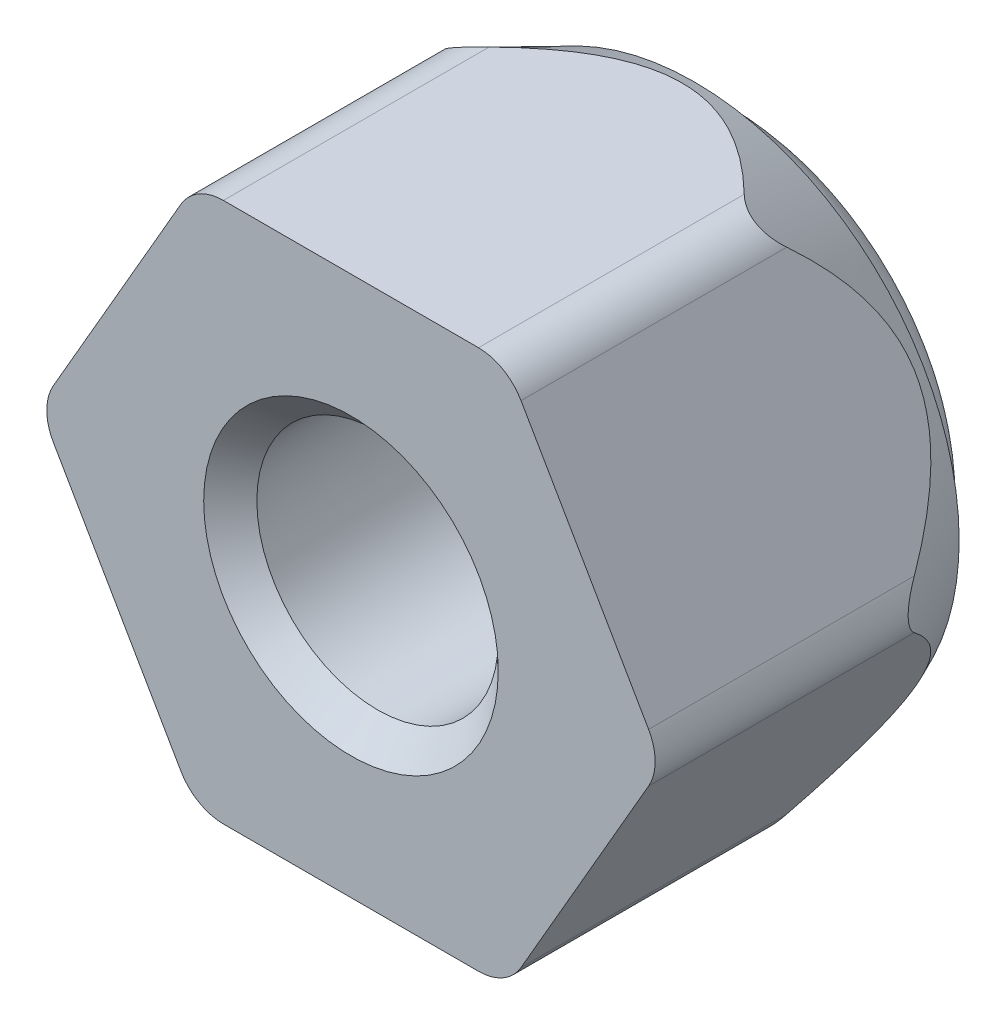
ISO-10303-21;
HEADER;
FILE_DESCRIPTION(('STEP AP214'),'2;1');
FILE_NAME('part.step','',(''),(''),'','','');
FILE_SCHEMA(('AUTOMOTIVE_DESIGN { 1 0 10303 214 1 1 1 1 }'));
ENDSEC;
DATA;
#1=APPLICATION_CONTEXT('core data for automotive mechanical design processes');
#2=APPLICATION_PROTOCOL_DEFINITION('international standard','automotive_design',2000,#1);
#3=PRODUCT_CONTEXT('',#1,'mechanical');
#4=PRODUCT('Part','Part','',(#3));
#5=PRODUCT_RELATED_PRODUCT_CATEGORY('part','',(#4));
#6=PRODUCT_DEFINITION_FORMATION('','',#4);
#7=PRODUCT_DEFINITION_CONTEXT('part definition',#1,'design');
#8=PRODUCT_DEFINITION('design','',#6,#7);
#9=PRODUCT_DEFINITION_SHAPE('','',#8);
#10=(LENGTH_UNIT() NAMED_UNIT(*) SI_UNIT(.MILLI.,.METRE.));
#11=(NAMED_UNIT(*) PLANE_ANGLE_UNIT() SI_UNIT($,.RADIAN.));
#12=(NAMED_UNIT(*) SI_UNIT($,.STERADIAN.) SOLID_ANGLE_UNIT());
#13=UNCERTAINTY_MEASURE_WITH_UNIT(LENGTH_MEASURE(1.E-05),#10,'distance_accuracy_value','');
#14=(GEOMETRIC_REPRESENTATION_CONTEXT(3) GLOBAL_UNCERTAINTY_ASSIGNED_CONTEXT((#13)) GLOBAL_UNIT_ASSIGNED_CONTEXT((#10,
#11,#12)) REPRESENTATION_CONTEXT('',''));
#15=CARTESIAN_POINT('',(0.,0.,0.));
#16=DIRECTION('',(0.,0.,1.));
#17=DIRECTION('',(1.,0.,0.));
#18=AXIS2_PLACEMENT_3D('',#15,#16,#17);
#19=CARTESIAN_POINT('',(0.,0.,-3.2));
#20=DIRECTION('',(0.,0.,1.));
#21=DIRECTION('',(1.,0.,0.));
#22=AXIS2_PLACEMENT_3D('',#19,#20,#21);
#23=CONICAL_SURFACE('',#22,2.8252125,0.412633370668645);
#24=CARTESIAN_POINT('',(-3.175425,0.,-2.4));
#25=CARTESIAN_POINT('',(-2.38156875,1.3749993589061,-4.21342756183746));
#26=CARTESIAN_POINT('',(-1.5877125,2.7499987178122,-2.4));
#27=(BOUNDED_CURVE() B_SPLINE_CURVE(2,(#24,#25,#26),.UNSPECIFIED.,.F.,
.F.) B_SPLINE_CURVE_WITH_KNOTS((3,3),(0.,3.72303709252941),
.UNSPECIFIED.) CURVE() GEOMETRIC_REPRESENTATION_ITEM() RATIONAL_B_SPLINE_CURVE((1.,
1.15470053837925,1.)) REPRESENTATION_ITEM(''));
#28=CARTESIAN_POINT('',(-3.03108743270664,0.249999999992984,-2.70620314324602));
#29=VERTEX_POINT('',#28);
#30=CARTESIAN_POINT('',(-1.73205006729336,2.49999871781922,-2.70620314324602));
#31=VERTEX_POINT('',#30);
#32=EDGE_CURVE('E167',#29,#31,#27,.T.);
#33=ORIENTED_EDGE('',*,*,#32,.T.);
#34=CARTESIAN_POINT('',(-1.73205006729741,2.4999987178122,-2.70620314325392));
#35=CARTESIAN_POINT('',(-1.72500235638727,2.51218065637914,-2.69249101317874));
#36=CARTESIAN_POINT('',(-1.71717853792669,2.52456508008095,-2.67923815831138));
#37=CARTESIAN_POINT('',(-1.69955003206397,2.54971978363477,-2.65407203787281));
#38=CARTESIAN_POINT('',(-1.68971821408732,2.56249305537071,-2.64218103480386));
#39=CARTESIAN_POINT('',(-1.66950301537542,2.58608976976235,-2.62224226638844));
#40=CARTESIAN_POINT('',(-1.6594331833388,2.59691307276756,-2.61388490022287));
#41=CARTESIAN_POINT('',(-1.63761038675392,2.6182364980293,-2.59935023034787));
#42=CARTESIAN_POINT('',(-1.62586657810883,2.62873802356967,-2.59316166265501));
#43=CARTESIAN_POINT('',(-1.6032850388694,2.64698657029615,-2.58450212274873));
#44=CARTESIAN_POINT('',(-1.59274391967273,2.65486132459152,-2.58153257362375));
#45=CARTESIAN_POINT('',(-1.5708041414586,2.6699026918324,-2.57759174847695));
#46=CARTESIAN_POINT('',(-1.55940546017375,2.6770692863787,-2.57662052436205));
#47=CARTESIAN_POINT('',(-1.53606199391658,2.69045364111738,-2.57677481640606));
#48=CARTESIAN_POINT('',(-1.52411664763664,2.69667039627269,-2.57790253708523));
#49=CARTESIAN_POINT('',(-1.50006761147746,2.70799862067953,-2.58214580661311));
#50=CARTESIAN_POINT('',(-1.48796391416191,2.71311003782435,-2.58526144914709));
#51=CARTESIAN_POINT('',(-1.46074331206648,2.7234066558375,-2.59426796580102));
#52=CARTESIAN_POINT('',(-1.44567199057678,2.72825704284705,-2.60067350963998));
#53=CARTESIAN_POINT('',(-1.41611677331774,2.73634130675424,-2.61563699284574));
#54=CARTESIAN_POINT('',(-1.40163628533218,2.73956676856398,-2.62420579884519));
#55=CARTESIAN_POINT('',(-1.37166041726426,2.74496151523924,-2.64412789120107));
#56=CARTESIAN_POINT('',(-1.35627880893126,2.74693830728615,-2.6556985455645));
#57=CARTESIAN_POINT('',(-1.3267795325607,2.74944154515591,-2.68011514586169));
#58=CARTESIAN_POINT('',(-1.31264742104093,2.74998751369189,-2.69294142123595));
#59=CARTESIAN_POINT('',(-1.29903736540519,2.7499987178122,-2.70620314325392));
#60=B_SPLINE_CURVE_WITH_KNOTS('',3,(#34,#35,#36,#37,#38,#39,#40,#41,#42,#43,#44,#45,#46,#47,#48,
#49,#50,#51,#52,#53,#54,#55,#56,#57,#58,#59),.UNSPECIFIED.,.F.,.F.,(4,2,2,2,2,2,2,2,2,2,2,2,4),
(0.,0.059057690934764,0.118973500909618,0.16973892411379,0.220236639722502,0.260527967179101,
0.300820341198279,0.341155058152381,0.381491676110493,0.432447114338653,0.483663793228779,
0.541556996478376,0.598656067901465),.UNSPECIFIED.);
#61=CARTESIAN_POINT('',(-1.29903736541329,2.7499987178122,-2.70620314324602));
#62=VERTEX_POINT('',#61);
#63=EDGE_CURVE('E262',#31,#62,#60,.T.);
#64=ORIENTED_EDGE('',*,*,#63,.T.);
#65=CARTESIAN_POINT('',(-1.5877125,2.7499987178122,-2.4));
#66=CARTESIAN_POINT('',(0.,2.7499987178122,-4.21342756183746));
#67=CARTESIAN_POINT('',(1.5877125,2.7499987178122,-2.4));
#68=(BOUNDED_CURVE() B_SPLINE_CURVE(2,(#65,#66,#67),.UNSPECIFIED.,.F.,
.F.) B_SPLINE_CURVE_WITH_KNOTS((3,3),(0.,3.72303709252942),
.UNSPECIFIED.) CURVE() GEOMETRIC_REPRESENTATION_ITEM() RATIONAL_B_SPLINE_CURVE((1.,
1.15470053837925,1.)) REPRESENTATION_ITEM(''));
#69=CARTESIAN_POINT('',(1.29903736541329,2.7499987178122,-2.70620314324602));
#70=VERTEX_POINT('',#69);
#71=EDGE_CURVE('E162',#62,#70,#68,.T.);
#72=ORIENTED_EDGE('',*,*,#71,.T.);
#73=CARTESIAN_POINT('',(1.29903736540519,2.7499987178122,-2.70620314325392));
#74=CARTESIAN_POINT('',(1.31311108912656,2.74998619040896,-2.69249101317874));
#75=CARTESIAN_POINT('',(1.32774822389385,2.7494027767184,-2.67923815831138));
#76=CARTESIAN_POINT('',(1.35834708912749,2.74671339458744,-2.65407203787281));
#77=CARTESIAN_POINT('',(1.37432497592857,2.74458542632225,-2.64218103480386));
#78=CARTESIAN_POINT('',(1.40486792939354,2.73887690789101,-2.62224226638844));
#79=CARTESIAN_POINT('',(1.41927610076722,2.73556782903806,-2.61388490022287));
#80=CARTESIAN_POINT('',(1.44865412703202,2.7273304454448,-2.59935023034788));
#81=CARTESIAN_POINT('',(1.46362061925102,2.72241077159115,-2.59316166265501));
#82=CARTESIAN_POINT('',(1.49071509391801,2.7119788583165,-2.58450212274873));
#83=CARTESIAN_POINT('',(1.5028053907847,2.70678735845554,-2.58153257362375));
#84=CARTESIAN_POINT('',(1.52680148603002,2.69530763678915,-2.57759174847695));
#85=CARTESIAN_POINT('',(1.53870727960816,2.68901938649998,-2.57662052436205));
#86=CARTESIAN_POINT('',(1.5619702039537,2.67549552907822,-2.57677481640606));
#87=CARTESIAN_POINT('',(1.57332674498728,2.66825893332045,-2.57790253708523));
#88=CARTESIAN_POINT('',(1.59516179318297,2.6530959692735,-2.58214580661311));
#89=CARTESIAN_POINT('',(1.60564025893749,2.64516956849091,-2.58526144914709));
#90=CARTESIAN_POINT('',(1.62816769275766,2.62674414457654,-2.59426796580102));
#91=CARTESIAN_POINT('',(1.63990391187096,2.61611719080263,-2.60067350963998));
#92=CARTESIAN_POINT('',(1.66168269841501,2.59456375379553,-2.61563699284574));
#93=CARTESIAN_POINT('',(1.67171627427397,2.58363601424571,-2.62420579884518));
#94=CARTESIAN_POINT('',(1.69137619597568,2.56037352433603,-2.64412789120107));
#95=CARTESIAN_POINT('',(1.7007789522728,2.54804105679204,-2.6556985455645));
#96=CARTESIAN_POINT('',(1.71769645804501,2.52374555299677,-2.68011514586169));
#97=CARTESIAN_POINT('',(1.72523533642672,2.51177976967952,-2.69294142123595));
#98=CARTESIAN_POINT('',(1.73205006729741,2.4999987178122,-2.70620314325392));
#99=B_SPLINE_CURVE_WITH_KNOTS('',3,(#73,#74,#75,#76,#77,#78,#79,#80,#81,#82,#83,#84,#85,#86,#87,
#88,#89,#90,#91,#92,#93,#94,#95,#96,#97,#98),.UNSPECIFIED.,.F.,.F.,(4,2,2,2,2,2,2,2,2,2,2,2,4),
(0.,0.0590576909347634,0.118973500909618,0.169738924113791,0.220236639722502,0.2605279671791,
0.300820341198279,0.34115505815238,0.381491676110492,0.432447114338652,0.483663793228778,
0.541556996478377,0.598656067901467),.UNSPECIFIED.);
#100=CARTESIAN_POINT('',(1.73205006729336,2.49999871781921,-2.70620314324602));
#101=VERTEX_POINT('',#100);
#102=EDGE_CURVE('E256',#70,#101,#99,.T.);
#103=ORIENTED_EDGE('',*,*,#102,.T.);
#104=CARTESIAN_POINT('',(1.5877125,2.7499987178122,-2.4));
#105=CARTESIAN_POINT('',(2.38156875,1.3749993589061,-4.21342756183746));
#106=CARTESIAN_POINT('',(3.175425,0.,-2.4));
#107=(BOUNDED_CURVE() B_SPLINE_CURVE(2,(#104,#105,#106),.UNSPECIFIED.,.F.,
.F.) B_SPLINE_CURVE_WITH_KNOTS((3,3),(0.,3.72303709252941),
.UNSPECIFIED.) CURVE() GEOMETRIC_REPRESENTATION_ITEM() RATIONAL_B_SPLINE_CURVE((1.,
1.15470053837925,1.)) REPRESENTATION_ITEM(''));
#108=CARTESIAN_POINT('',(3.03108743270665,0.249999999992984,-2.70620314324602));
#109=VERTEX_POINT('',#108);
#110=EDGE_CURVE('E168',#101,#109,#107,.T.);
#111=ORIENTED_EDGE('',*,*,#110,.T.);
#112=CARTESIAN_POINT('',(3.03108743270259,0.25,-2.70620314325392));
#113=CARTESIAN_POINT('',(3.03811344551384,0.237805534029827,-2.69249101317874));
#114=CARTESIAN_POINT('',(3.04492676182054,0.224837696637456,-2.67923815831138));
#115=CARTESIAN_POINT('',(3.05789712119146,0.196993610952672,-2.65407203787281));
#116=CARTESIAN_POINT('',(3.0640431900159,0.182092370951542,-2.64218103480386));
#117=CARTESIAN_POINT('',(3.07437094476896,0.152787138128663,-2.62224226638844));
#118=CARTESIAN_POINT('',(3.07870928410602,0.138654756270495,-2.61388490022287));
#119=CARTESIAN_POINT('',(3.08626451378594,0.109093947415508,-2.59935023034787));
#120=CARTESIAN_POINT('',(3.08948719735984,0.0936727480214839,-2.59316166265501));
#121=CARTESIAN_POINT('',(3.09400013278741,0.0649922880203447,-2.58450212274873));
#122=CARTESIAN_POINT('',(3.09554931045743,0.0519260338640227,-2.58153257362375));
#123=CARTESIAN_POINT('',(3.09760562748861,0.0254049449567513,-2.57759174847695));
#124=CARTESIAN_POINT('',(3.09811273978191,0.0119501001212815,-2.57662052436205));
#125=CARTESIAN_POINT('',(3.09803219787028,-0.014958112039155,-2.57677481640606));
#126=CARTESIAN_POINT('',(3.09744339262392,-0.0284114629522359,-2.57790253708523));
#127=CARTESIAN_POINT('',(3.09522940466043,-0.0549026514060384,-2.58214580661311));
#128=CARTESIAN_POINT('',(3.0936041730994,-0.0679404693334342,-2.58526144914709));
#129=CARTESIAN_POINT('',(3.08891100482414,-0.0966625112609584,-2.59426796580102));
#130=CARTESIAN_POINT('',(3.08557590244774,-0.112139852044413,-2.60067350963998));
#131=CARTESIAN_POINT('',(3.07779947173275,-0.141777552958704,-2.61563699284574));
#132=CARTESIAN_POINT('',(3.07335255960614,-0.155930754318271,-2.62420579884518));
#133=CARTESIAN_POINT('',(3.06303661323994,-0.184587990903203,-2.64412789120107));
#134=CARTESIAN_POINT('',(3.05705776120406,-0.1988972504941,-2.65569854556449));
#135=CARTESIAN_POINT('',(3.04447599060571,-0.225695992159148,-2.68011514586168));
#136=CARTESIAN_POINT('',(3.03788275746765,-0.238207744012375,-2.69294142123595));
#137=CARTESIAN_POINT('',(3.03108743270259,-0.25,-2.70620314325392));
#138=B_SPLINE_CURVE_WITH_KNOTS('',3,(#112,#113,#114,#115,#116,#117,#118,#119,#120,#121,#122,
#123,#124,#125,#126,#127,#128,#129,#130,#131,#132,#133,#134,#135,#136,#137),.UNSPECIFIED.,.F.,
.F.,(4,2,2,2,2,2,2,2,2,2,2,2,4),(0.,0.0590576909347644,0.118973500909619,0.169738924113791,
0.220236639722502,0.2605279671791,0.300820341198279,0.341155058152381,0.381491676110493,
0.432447114338652,0.483663793228777,0.541556996478376,0.598656067901467),.UNSPECIFIED.);
#139=CARTESIAN_POINT('',(3.03108743270664,-0.249999999992985,-2.70620314324602));
#140=VERTEX_POINT('',#139);
#141=EDGE_CURVE('E213',#109,#140,#138,.T.);
#142=ORIENTED_EDGE('',*,*,#141,.T.);
#143=CARTESIAN_POINT('',(3.175425,0.,-2.4));
#144=CARTESIAN_POINT('',(2.38156875,-1.3749993589061,-4.21342756183746));
#145=CARTESIAN_POINT('',(1.5877125,-2.7499987178122,-2.4));
#146=(BOUNDED_CURVE() B_SPLINE_CURVE(2,(#143,#144,#145),.UNSPECIFIED.,.F.,
.F.) B_SPLINE_CURVE_WITH_KNOTS((3,3),(0.,3.72303709252941),
.UNSPECIFIED.) CURVE() GEOMETRIC_REPRESENTATION_ITEM() RATIONAL_B_SPLINE_CURVE((1.,
1.15470053837925,1.)) REPRESENTATION_ITEM(''));
#147=CARTESIAN_POINT('',(1.73205006729336,-2.49999871781922,-2.70620314324602));
#148=VERTEX_POINT('',#147);
#149=EDGE_CURVE('E154',#140,#148,#146,.T.);
#150=ORIENTED_EDGE('',*,*,#149,.T.);
#151=CARTESIAN_POINT('',(1.73205006729741,-2.4999987178122,-2.70620314325392));
#152=CARTESIAN_POINT('',(1.72500235638727,-2.51218065637914,-2.69249101317874));
#153=CARTESIAN_POINT('',(1.71717853792669,-2.52456508008095,-2.67923815831138));
#154=CARTESIAN_POINT('',(1.69955003206397,-2.54971978363477,-2.65407203787281));
#155=CARTESIAN_POINT('',(1.68971821408733,-2.56249305537071,-2.64218103480385));
#156=CARTESIAN_POINT('',(1.66950301537542,-2.58608976976235,-2.62224226638844));
#157=CARTESIAN_POINT('',(1.6594331833388,-2.59691307276756,-2.61388490022287));
#158=CARTESIAN_POINT('',(1.63761038675392,-2.6182364980293,-2.59935023034788));
#159=CARTESIAN_POINT('',(1.62586657810883,-2.62873802356967,-2.59316166265501));
#160=CARTESIAN_POINT('',(1.6032850388694,-2.64698657029615,-2.58450212274873));
#161=CARTESIAN_POINT('',(1.59274391967273,-2.65486132459152,-2.58153257362375));
#162=CARTESIAN_POINT('',(1.5708041414586,-2.6699026918324,-2.57759174847695));
#163=CARTESIAN_POINT('',(1.55940546017375,-2.6770692863787,-2.57662052436205));
#164=CARTESIAN_POINT('',(1.53606199391658,-2.69045364111738,-2.57677481640606));
#165=CARTESIAN_POINT('',(1.52411664763664,-2.69667039627269,-2.57790253708523));
#166=CARTESIAN_POINT('',(1.50006761147746,-2.70799862067953,-2.58214580661311));
#167=CARTESIAN_POINT('',(1.48796391416191,-2.71311003782435,-2.58526144914709));
#168=CARTESIAN_POINT('',(1.46074331206648,-2.7234066558375,-2.59426796580102));
#169=CARTESIAN_POINT('',(1.44567199057678,-2.72825704284705,-2.60067350963998));
#170=CARTESIAN_POINT('',(1.41611677331774,-2.73634130675424,-2.61563699284574));
#171=CARTESIAN_POINT('',(1.40163628533218,-2.73956676856398,-2.62420579884518));
#172=CARTESIAN_POINT('',(1.37166041726427,-2.74496151523924,-2.64412789120107));
#173=CARTESIAN_POINT('',(1.35627880893126,-2.74693830728615,-2.6556985455645));
#174=CARTESIAN_POINT('',(1.3267795325607,-2.74944154515592,-2.68011514586169));
#175=CARTESIAN_POINT('',(1.31264742104093,-2.74998751369189,-2.69294142123595));
#176=CARTESIAN_POINT('',(1.29903736540519,-2.7499987178122,-2.70620314325392));
#177=B_SPLINE_CURVE_WITH_KNOTS('',3,(#151,#152,#153,#154,#155,#156,#157,#158,#159,#160,#161,
#162,#163,#164,#165,#166,#167,#168,#169,#170,#171,#172,#173,#174,#175,#176),.UNSPECIFIED.,.F.,
.F.,(4,2,2,2,2,2,2,2,2,2,2,2,4),(0.,0.0590576909347641,0.118973500909619,0.169738924113791,
0.220236639722501,0.2605279671791,0.300820341198278,0.34115505815238,0.381491676110492,
0.432447114338651,0.483663793228777,0.541556996478377,0.598656067901466),.UNSPECIFIED.);
#178=CARTESIAN_POINT('',(1.29903736541329,-2.7499987178122,-2.70620314324602));
#179=VERTEX_POINT('',#178);
#180=EDGE_CURVE('E220',#148,#179,#177,.T.);
#181=ORIENTED_EDGE('',*,*,#180,.T.);
#182=CARTESIAN_POINT('',(1.5877125,-2.7499987178122,-2.4));
#183=CARTESIAN_POINT('',(0.,-2.7499987178122,-4.21342756183746));
#184=CARTESIAN_POINT('',(-1.5877125,-2.7499987178122,-2.4));
#185=(BOUNDED_CURVE() B_SPLINE_CURVE(2,(#182,#183,#184),.UNSPECIFIED.,.F.,
.F.) B_SPLINE_CURVE_WITH_KNOTS((3,3),(0.,3.72303709252942),
.UNSPECIFIED.) CURVE() GEOMETRIC_REPRESENTATION_ITEM() RATIONAL_B_SPLINE_CURVE((1.,
1.15470053837925,1.)) REPRESENTATION_ITEM(''));
#186=CARTESIAN_POINT('',(-1.29903736541329,-2.7499987178122,-2.70620314324602));
#187=VERTEX_POINT('',#186);
#188=EDGE_CURVE('E150',#179,#187,#185,.T.);
#189=ORIENTED_EDGE('',*,*,#188,.T.);
#190=CARTESIAN_POINT('',(-1.29903736540519,-2.7499987178122,-2.70620314325392));
#191=CARTESIAN_POINT('',(-1.31311108912656,-2.74998619040897,-2.69249101317874));
#192=CARTESIAN_POINT('',(-1.32774822389385,-2.7494027767184,-2.67923815831138));
#193=CARTESIAN_POINT('',(-1.35834708912749,-2.74671339458744,-2.65407203787281));
#194=CARTESIAN_POINT('',(-1.37432497592857,-2.74458542632225,-2.64218103480386));
#195=CARTESIAN_POINT('',(-1.40486792939354,-2.73887690789101,-2.62224226638844));
#196=CARTESIAN_POINT('',(-1.41927610076722,-2.73556782903806,-2.61388490022286));
#197=CARTESIAN_POINT('',(-1.44865412703202,-2.72733044544481,-2.59935023034787));
#198=CARTESIAN_POINT('',(-1.46362061925102,-2.72241077159115,-2.59316166265501));
#199=CARTESIAN_POINT('',(-1.49071509391801,-2.7119788583165,-2.58450212274873));
#200=CARTESIAN_POINT('',(-1.5028053907847,-2.70678735845555,-2.58153257362375));
#201=CARTESIAN_POINT('',(-1.52680148603002,-2.69530763678915,-2.57759174847695));
#202=CARTESIAN_POINT('',(-1.53870727960816,-2.68901938649998,-2.57662052436205));
#203=CARTESIAN_POINT('',(-1.5619702039537,-2.67549552907822,-2.57677481640606));
#204=CARTESIAN_POINT('',(-1.57332674498728,-2.66825893332045,-2.57790253708523));
#205=CARTESIAN_POINT('',(-1.59516179318297,-2.6530959692735,-2.58214580661311));
#206=CARTESIAN_POINT('',(-1.60564025893749,-2.64516956849091,-2.58526144914709));
#207=CARTESIAN_POINT('',(-1.62816769275766,-2.62674414457654,-2.59426796580102));
#208=CARTESIAN_POINT('',(-1.63990391187096,-2.61611719080263,-2.60067350963998));
#209=CARTESIAN_POINT('',(-1.66168269841501,-2.59456375379553,-2.61563699284574));
#210=CARTESIAN_POINT('',(-1.67171627427397,-2.58363601424571,-2.62420579884518));
#211=CARTESIAN_POINT('',(-1.69137619597568,-2.56037352433604,-2.64412789120107));
#212=CARTESIAN_POINT('',(-1.7007789522728,-2.54804105679205,-2.6556985455645));
#213=CARTESIAN_POINT('',(-1.71769645804501,-2.52374555299677,-2.68011514586169));
#214=CARTESIAN_POINT('',(-1.72523533642672,-2.51177976967952,-2.69294142123595));
#215=CARTESIAN_POINT('',(-1.73205006729741,-2.4999987178122,-2.70620314325392));
#216=B_SPLINE_CURVE_WITH_KNOTS('',3,(#190,#191,#192,#193,#194,#195,#196,#197,#198,#199,#200,
#201,#202,#203,#204,#205,#206,#207,#208,#209,#210,#211,#212,#213,#214,#215),.UNSPECIFIED.,.F.,
.F.,(4,2,2,2,2,2,2,2,2,2,2,2,4),(0.,0.059057690934764,0.118973500909619,0.169738924113791,
0.220236639722502,0.2605279671791,0.300820341198278,0.341155058152381,0.381491676110492,
0.432447114338652,0.483663793228777,0.541556996478377,0.598656067901467),.UNSPECIFIED.);
#217=CARTESIAN_POINT('',(-1.73205006729336,-2.49999871781921,-2.70620314324602));
#218=VERTEX_POINT('',#217);
#219=EDGE_CURVE('E242',#187,#218,#216,.T.);
#220=ORIENTED_EDGE('',*,*,#219,.T.);
#221=CARTESIAN_POINT('',(-1.5877125,-2.7499987178122,-2.4));
#222=CARTESIAN_POINT('',(-2.38156875,-1.3749993589061,-4.21342756183746));
#223=CARTESIAN_POINT('',(-3.175425,0.,-2.4));
#224=(BOUNDED_CURVE() B_SPLINE_CURVE(2,(#221,#222,#223),.UNSPECIFIED.,.F.,
.F.) B_SPLINE_CURVE_WITH_KNOTS((3,3),(0.,3.72303709252941),
.UNSPECIFIED.) CURVE() GEOMETRIC_REPRESENTATION_ITEM() RATIONAL_B_SPLINE_CURVE((1.,
1.15470053837925,1.)) REPRESENTATION_ITEM(''));
#225=CARTESIAN_POINT('',(-3.03108743270665,-0.249999999992985,-2.70620314324602));
#226=VERTEX_POINT('',#225);
#227=EDGE_CURVE('E190',#218,#226,#224,.T.);
#228=ORIENTED_EDGE('',*,*,#227,.T.);
#229=CARTESIAN_POINT('',(-3.03108743270259,-0.25,-2.70620314325392));
#230=CARTESIAN_POINT('',(-3.03811344551384,-0.237805534029827,-2.69249101317874));
#231=CARTESIAN_POINT('',(-3.04492676182054,-0.224837696637456,-2.67923815831138));
#232=CARTESIAN_POINT('',(-3.05789712119146,-0.196993610952673,-2.65407203787281));
#233=CARTESIAN_POINT('',(-3.0640431900159,-0.182092370951543,-2.64218103480386));
#234=CARTESIAN_POINT('',(-3.07437094476896,-0.152787138128664,-2.62224226638844));
#235=CARTESIAN_POINT('',(-3.07870928410602,-0.138654756270495,-2.61388490022287));
#236=CARTESIAN_POINT('',(-3.08626451378594,-0.109093947415508,-2.59935023034788));
#237=CARTESIAN_POINT('',(-3.08948719735984,-0.0936727480214842,-2.59316166265501));
#238=CARTESIAN_POINT('',(-3.09400013278741,-0.064992288020345,-2.58450212274873));
#239=CARTESIAN_POINT('',(-3.09554931045743,-0.051926033864023,-2.58153257362375));
#240=CARTESIAN_POINT('',(-3.09760562748861,-0.0254049449567515,-2.57759174847695));
#241=CARTESIAN_POINT('',(-3.09811273978191,-0.0119501001212817,-2.57662052436205));
#242=CARTESIAN_POINT('',(-3.09803219787028,0.0149581120391547,-2.57677481640606));
#243=CARTESIAN_POINT('',(-3.09744339262392,0.0284114629522355,-2.57790253708523));
#244=CARTESIAN_POINT('',(-3.09522940466043,0.0549026514060381,-2.58214580661311));
#245=CARTESIAN_POINT('',(-3.0936041730994,0.0679404693334338,-2.58526144914709));
#246=CARTESIAN_POINT('',(-3.08891100482414,0.0966625112609583,-2.59426796580102));
#247=CARTESIAN_POINT('',(-3.08557590244774,0.112139852044413,-2.60067350963997));
#248=CARTESIAN_POINT('',(-3.07779947173275,0.141777552958705,-2.61563699284574));
#249=CARTESIAN_POINT('',(-3.07335255960614,0.155930754318271,-2.62420579884518));
#250=CARTESIAN_POINT('',(-3.06303661323994,0.184587990903203,-2.64412789120107));
#251=CARTESIAN_POINT('',(-3.05705776120406,0.1988972504941,-2.6556985455645));
#252=CARTESIAN_POINT('',(-3.04447599060571,0.225695992159148,-2.68011514586169));
#253=CARTESIAN_POINT('',(-3.03788275746765,0.238207744012375,-2.69294142123595));
#254=CARTESIAN_POINT('',(-3.03108743270259,0.249999999999999,-2.70620314325392));
#255=B_SPLINE_CURVE_WITH_KNOTS('',3,(#229,#230,#231,#232,#233,#234,#235,#236,#237,#238,#239,
#240,#241,#242,#243,#244,#245,#246,#247,#248,#249,#250,#251,#252,#253,#254),.UNSPECIFIED.,.F.,
.F.,(4,2,2,2,2,2,2,2,2,2,2,2,4),(0.,0.0590576909347636,0.118973500909618,0.16973892411379,
0.220236639722501,0.260527967179099,0.300820341198278,0.34115505815238,0.381491676110492,
0.432447114338651,0.483663793228776,0.541556996478376,0.598656067901466),.UNSPECIFIED.);
#256=EDGE_CURVE('E249',#226,#29,#255,.T.);
#257=ORIENTED_EDGE('',*,*,#256,.T.);
#258=EDGE_LOOP('',(#33,#64,#72,#103,#111,#142,#150,#181,#189,#220,#228,#257));
#259=FACE_BOUND('',#258,.T.);
#260=CARTESIAN_POINT('',(0.,0.,-3.5));
#261=DIRECTION('',(0.,0.,-1.));
#262=DIRECTION('',(0.,1.,0.));
#263=AXIS2_PLACEMENT_3D('',#260,#261,#262);
#264=CIRCLE('',#263,2.6938828125);
#265=CARTESIAN_POINT('',(0.,2.6938828125,-3.5));
#266=VERTEX_POINT('',#265);
#267=EDGE_CURVE('E176',#266,#266,#264,.F.);
#268=ORIENTED_EDGE('',*,*,#267,.T.);
#269=EDGE_LOOP('',(#268));
#270=FACE_BOUND('',#269,.T.);
#271=ADVANCED_FACE('F38',(#259,#270),#23,.T.);
#272=CARTESIAN_POINT('',(0.,0.,-4.));
#273=DIRECTION('',(0.,0.,-1.));
#274=DIRECTION('',(1.,0.,0.));
#275=AXIS2_PLACEMENT_3D('',#272,#273,#274);
#276=PLANE('',#275);
#277=CARTESIAN_POINT('',(0.,0.,-4.));
#278=DIRECTION('',(0.,0.,-1.));
#279=DIRECTION('',(0.,1.,0.));
#280=AXIS2_PLACEMENT_3D('',#277,#278,#279);
#281=CIRCLE('',#280,1.94545125400218);
#282=CARTESIAN_POINT('',(0.,1.94545125400218,-4.));
#283=VERTEX_POINT('',#282);
#284=EDGE_CURVE('E308',#283,#283,#281,.T.);
#285=ORIENTED_EDGE('',*,*,#284,.T.);
#286=EDGE_LOOP('',(#285));
#287=FACE_BOUND('',#286,.T.);
#288=CARTESIAN_POINT('',(0.,0.,-4.));
#289=DIRECTION('',(0.,0.,1.));
#290=DIRECTION('',(1.,0.,0.));
#291=AXIS2_PLACEMENT_3D('',#288,#289,#290);
#292=CIRCLE('',#291,1.5);
#293=CARTESIAN_POINT('',(1.5,0.,-4.));
#294=VERTEX_POINT('',#293);
#295=EDGE_CURVE('E161',#294,#294,#292,.T.);
#296=ORIENTED_EDGE('',*,*,#295,.T.);
#297=EDGE_LOOP('',(#296));
#298=FACE_BOUND('',#297,.T.);
#299=ADVANCED_FACE('F230',(#287,#298),#276,.T.);
#300=CARTESIAN_POINT('',(0.,0.,-0.1353125));
#301=DIRECTION('',(0.,0.,1.));
#302=DIRECTION('',(1.,0.,0.));
#303=AXIS2_PLACEMENT_3D('',#300,#301,#302);
#304=CONICAL_SURFACE('',#303,1.3646875,0.785398163397448);
#305=CARTESIAN_POINT('',(0.,0.,-0.270625));
#306=DIRECTION('',(0.,0.,-1.));
#307=DIRECTION('',(1.,0.,0.));
#308=AXIS2_PLACEMENT_3D('',#305,#306,#307);
#309=CIRCLE('',#308,1.229375);
#310=CARTESIAN_POINT('',(1.229375,0.,-0.270625));
#311=VERTEX_POINT('',#310);
#312=EDGE_CURVE('E141',#311,#311,#309,.T.);
#313=ORIENTED_EDGE('',*,*,#312,.T.);
#314=EDGE_LOOP('',(#313));
#315=FACE_BOUND('',#314,.T.);
#316=CARTESIAN_POINT('',(0.,0.,0.));
#317=DIRECTION('',(0.,0.,-1.));
#318=DIRECTION('',(1.,0.,0.));
#319=AXIS2_PLACEMENT_3D('',#316,#317,#318);
#320=CIRCLE('',#319,1.5);
#321=CARTESIAN_POINT('',(1.5,0.,0.));
#322=VERTEX_POINT('',#321);
#323=EDGE_CURVE('E169',#322,#322,#320,.T.);
#324=ORIENTED_EDGE('',*,*,#323,.F.);
#325=EDGE_LOOP('',(#324));
#326=FACE_BOUND('',#325,.T.);
#327=ADVANCED_FACE('F376',(#315,#326),#304,.F.);
#328=CARTESIAN_POINT('',(0.,0.,-2.));
#329=DIRECTION('',(0.,0.,1.));
#330=DIRECTION('',(1.,0.,0.));
#331=AXIS2_PLACEMENT_3D('',#328,#329,#330);
#332=CYLINDRICAL_SURFACE('',#331,1.229375);
#333=CARTESIAN_POINT('',(0.,0.,-3.729375));
#334=DIRECTION('',(0.,0.,-1.));
#335=DIRECTION('',(1.,0.,0.));
#336=AXIS2_PLACEMENT_3D('',#333,#334,#335);
#337=CIRCLE('',#336,1.229375);
#338=CARTESIAN_POINT('',(1.229375,0.,-3.729375));
#339=VERTEX_POINT('',#338);
#340=EDGE_CURVE('E145',#339,#339,#337,.T.);
#341=ORIENTED_EDGE('',*,*,#340,.T.);
#342=EDGE_LOOP('',(#341));
#343=FACE_BOUND('',#342,.T.);
#344=ORIENTED_EDGE('',*,*,#312,.F.);
#345=EDGE_LOOP('',(#344));
#346=FACE_BOUND('',#345,.T.);
#347=ADVANCED_FACE('F142',(#343,#346),#332,.F.);
#348=CARTESIAN_POINT('',(0.,0.,-3.8646875));
#349=DIRECTION('',(0.,0.,-1.));
#350=DIRECTION('',(1.,0.,0.));
#351=AXIS2_PLACEMENT_3D('',#348,#349,#350);
#352=CONICAL_SURFACE('',#351,1.3646875,0.785398163397448);
#353=ORIENTED_EDGE('',*,*,#295,.F.);
#354=EDGE_LOOP('',(#353));
#355=FACE_BOUND('',#354,.T.);
#356=ORIENTED_EDGE('',*,*,#340,.F.);
#357=EDGE_LOOP('',(#356));
#358=FACE_BOUND('',#357,.T.);
#359=ADVANCED_FACE('F370',(#355,#358),#352,.F.);
#360=CARTESIAN_POINT('',(-2.38156875,1.3749993589061,0.));
#361=DIRECTION('',(-0.866025403784439,0.5,0.));
#362=DIRECTION('',(0.5,0.866025403784439,0.));
#363=AXIS2_PLACEMENT_3D('',#360,#361,#362);
#364=PLANE('',#363);
#365=DIRECTION('',(0.5,0.866025403784439,0.));
#366=VECTOR('',#365,1.);
#367=CARTESIAN_POINT('',(-3.175425,0.,0.));
#368=LINE('',#367,#366);
#369=CARTESIAN_POINT('',(-3.03108743270259,0.25,0.));
#370=VERTEX_POINT('',#369);
#371=CARTESIAN_POINT('',(-1.73205006729741,2.4999987178122,0.));
#372=VERTEX_POINT('',#371);
#373=EDGE_CURVE('E182',#370,#372,#368,.T.);
#374=ORIENTED_EDGE('',*,*,#373,.T.);
#375=DIRECTION('',(0.,0.,-1.));
#376=VECTOR('',#375,1.);
#377=CARTESIAN_POINT('',(-1.73205006729741,2.4999987178122,0.));
#378=LINE('',#377,#376);
#379=EDGE_CURVE('E147',#372,#31,#378,.T.);
#380=ORIENTED_EDGE('',*,*,#379,.T.);
#381=ORIENTED_EDGE('',*,*,#32,.F.);
#382=DIRECTION('',(0.,0.,-1.));
#383=VECTOR('',#382,1.);
#384=CARTESIAN_POINT('',(-3.03108743270259,0.25,0.));
#385=LINE('',#384,#383);
#386=EDGE_CURVE('E144',#29,#370,#385,.F.);
#387=ORIENTED_EDGE('',*,*,#386,.T.);
#388=EDGE_LOOP('',(#374,#380,#381,#387));
#389=FACE_BOUND('',#388,.T.);
#390=ADVANCED_FACE('F234',(#389),#364,.T.);
#391=CARTESIAN_POINT('',(-2.38156875,-1.3749993589061,0.));
#392=DIRECTION('',(-0.866025403784439,-0.5,0.));
#393=DIRECTION('',(-0.5,0.866025403784439,0.));
#394=AXIS2_PLACEMENT_3D('',#391,#392,#393);
#395=PLANE('',#394);
#396=DIRECTION('',(-0.5,0.866025403784439,0.));
#397=VECTOR('',#396,1.);
#398=CARTESIAN_POINT('',(-1.5877125,-2.7499987178122,0.));
#399=LINE('',#398,#397);
#400=CARTESIAN_POINT('',(-1.73205006729741,-2.4999987178122,0.));
#401=VERTEX_POINT('',#400);
#402=CARTESIAN_POINT('',(-3.03108743270259,-0.249999999999998,0.));
#403=VERTEX_POINT('',#402);
#404=EDGE_CURVE('E160',#401,#403,#399,.T.);
#405=ORIENTED_EDGE('',*,*,#404,.T.);
#406=DIRECTION('',(0.,0.,-1.));
#407=VECTOR('',#406,1.);
#408=CARTESIAN_POINT('',(-3.03108743270259,-0.25,0.));
#409=LINE('',#408,#407);
#410=EDGE_CURVE('E318',#403,#226,#409,.T.);
#411=ORIENTED_EDGE('',*,*,#410,.T.);
#412=ORIENTED_EDGE('',*,*,#227,.F.);
#413=DIRECTION('',(0.,0.,-1.));
#414=VECTOR('',#413,1.);
#415=CARTESIAN_POINT('',(-1.73205006729741,-2.4999987178122,0.));
#416=LINE('',#415,#414);
#417=EDGE_CURVE('E316',#218,#401,#416,.F.);
#418=ORIENTED_EDGE('',*,*,#417,.T.);
#419=EDGE_LOOP('',(#405,#411,#412,#418));
#420=FACE_BOUND('',#419,.T.);
#421=ADVANCED_FACE('F414',(#420),#395,.T.);
#422=CARTESIAN_POINT('',(0.,-2.7499987178122,0.));
#423=DIRECTION('',(0.,-1.,0.));
#424=DIRECTION('',(-1.,0.,0.));
#425=AXIS2_PLACEMENT_3D('',#422,#423,#424);
#426=PLANE('',#425);
#427=DIRECTION('',(-1.,0.,0.));
#428=VECTOR('',#427,1.);
#429=CARTESIAN_POINT('',(1.5877125,-2.7499987178122,0.));
#430=LINE('',#429,#428);
#431=CARTESIAN_POINT('',(1.29903736540519,-2.7499987178122,0.));
#432=VERTEX_POINT('',#431);
#433=CARTESIAN_POINT('',(-1.29903736540519,-2.7499987178122,0.));
#434=VERTEX_POINT('',#433);
#435=EDGE_CURVE('E158',#432,#434,#430,.T.);
#436=ORIENTED_EDGE('',*,*,#435,.T.);
#437=DIRECTION('',(0.,0.,-1.));
#438=VECTOR('',#437,1.);
#439=CARTESIAN_POINT('',(-1.29903736540519,-2.7499987178122,0.));
#440=LINE('',#439,#438);
#441=EDGE_CURVE('E322',#434,#187,#440,.T.);
#442=ORIENTED_EDGE('',*,*,#441,.T.);
#443=ORIENTED_EDGE('',*,*,#188,.F.);
#444=DIRECTION('',(0.,0.,-1.));
#445=VECTOR('',#444,1.);
#446=CARTESIAN_POINT('',(1.29903736540519,-2.7499987178122,0.));
#447=LINE('',#446,#445);
#448=EDGE_CURVE('E61',#179,#432,#447,.F.);
#449=ORIENTED_EDGE('',*,*,#448,.T.);
#450=EDGE_LOOP('',(#436,#442,#443,#449));
#451=FACE_BOUND('',#450,.T.);
#452=ADVANCED_FACE('F386',(#451),#426,.T.);
#453=CARTESIAN_POINT('',(2.38156875,1.3749993589061,0.));
#454=DIRECTION('',(0.866025403784439,0.5,0.));
#455=DIRECTION('',(0.5,-0.866025403784439,0.));
#456=AXIS2_PLACEMENT_3D('',#453,#454,#455);
#457=PLANE('',#456);
#458=ORIENTED_EDGE('',*,*,#110,.F.);
#459=DIRECTION('',(0.,0.,-1.));
#460=VECTOR('',#459,1.);
#461=CARTESIAN_POINT('',(1.73205006729741,2.4999987178122,0.));
#462=LINE('',#461,#460);
#463=CARTESIAN_POINT('',(1.73205006729741,2.4999987178122,0.));
#464=VERTEX_POINT('',#463);
#465=EDGE_CURVE('E314',#101,#464,#462,.F.);
#466=ORIENTED_EDGE('',*,*,#465,.T.);
#467=DIRECTION('',(0.5,-0.866025403784439,0.));
#468=VECTOR('',#467,1.);
#469=CARTESIAN_POINT('',(1.5877125,2.7499987178122,0.));
#470=LINE('',#469,#468);
#471=CARTESIAN_POINT('',(3.03108743270259,0.249999999999998,0.));
#472=VERTEX_POINT('',#471);
#473=EDGE_CURVE('E183',#464,#472,#470,.T.);
#474=ORIENTED_EDGE('',*,*,#473,.T.);
#475=DIRECTION('',(0.,0.,-1.));
#476=VECTOR('',#475,1.);
#477=CARTESIAN_POINT('',(3.03108743270259,0.25,0.));
#478=LINE('',#477,#476);
#479=EDGE_CURVE('E311',#472,#109,#478,.T.);
#480=ORIENTED_EDGE('',*,*,#479,.T.);
#481=EDGE_LOOP('',(#458,#466,#474,#480));
#482=FACE_BOUND('',#481,.T.);
#483=ADVANCED_FACE('F335',(#482),#457,.T.);
#484=CARTESIAN_POINT('',(0.,2.7499987178122,0.));
#485=DIRECTION('',(0.,1.,0.));
#486=DIRECTION('',(1.,0.,0.));
#487=AXIS2_PLACEMENT_3D('',#484,#485,#486);
#488=PLANE('',#487);
#489=ORIENTED_EDGE('',*,*,#71,.F.);
#490=DIRECTION('',(0.,0.,-1.));
#491=VECTOR('',#490,1.);
#492=CARTESIAN_POINT('',(-1.29903736540519,2.7499987178122,0.));
#493=LINE('',#492,#491);
#494=CARTESIAN_POINT('',(-1.29903736540519,2.7499987178122,0.));
#495=VERTEX_POINT('',#494);
#496=EDGE_CURVE('E299',#62,#495,#493,.F.);
#497=ORIENTED_EDGE('',*,*,#496,.T.);
#498=DIRECTION('',(1.,0.,0.));
#499=VECTOR('',#498,1.);
#500=CARTESIAN_POINT('',(-1.5877125,2.7499987178122,0.));
#501=LINE('',#500,#499);
#502=CARTESIAN_POINT('',(1.29903736540519,2.7499987178122,0.));
#503=VERTEX_POINT('',#502);
#504=EDGE_CURVE('E179',#495,#503,#501,.T.);
#505=ORIENTED_EDGE('',*,*,#504,.T.);
#506=DIRECTION('',(0.,0.,-1.));
#507=VECTOR('',#506,1.);
#508=CARTESIAN_POINT('',(1.29903736540519,2.7499987178122,0.));
#509=LINE('',#508,#507);
#510=EDGE_CURVE('E343',#503,#70,#509,.T.);
#511=ORIENTED_EDGE('',*,*,#510,.T.);
#512=EDGE_LOOP('',(#489,#497,#505,#511));
#513=FACE_BOUND('',#512,.T.);
#514=ADVANCED_FACE('F346',(#513),#488,.T.);
#515=CARTESIAN_POINT('',(2.38156875,-1.3749993589061,0.));
#516=DIRECTION('',(0.866025403784439,-0.5,0.));
#517=DIRECTION('',(-0.5,-0.866025403784439,0.));
#518=AXIS2_PLACEMENT_3D('',#515,#516,#517);
#519=PLANE('',#518);
#520=DIRECTION('',(-0.5,-0.866025403784439,0.));
#521=VECTOR('',#520,1.);
#522=CARTESIAN_POINT('',(3.175425,0.,0.));
#523=LINE('',#522,#521);
#524=CARTESIAN_POINT('',(3.03108743270259,-0.25,0.));
#525=VERTEX_POINT('',#524);
#526=CARTESIAN_POINT('',(1.73205006729741,-2.4999987178122,0.));
#527=VERTEX_POINT('',#526);
#528=EDGE_CURVE('E175',#525,#527,#523,.T.);
#529=ORIENTED_EDGE('',*,*,#528,.T.);
#530=DIRECTION('',(0.,0.,-1.));
#531=VECTOR('',#530,1.);
#532=CARTESIAN_POINT('',(1.73205006729741,-2.4999987178122,0.));
#533=LINE('',#532,#531);
#534=EDGE_CURVE('E11',#527,#148,#533,.T.);
#535=ORIENTED_EDGE('',*,*,#534,.T.);
#536=ORIENTED_EDGE('',*,*,#149,.F.);
#537=DIRECTION('',(0.,0.,-1.));
#538=VECTOR('',#537,1.);
#539=CARTESIAN_POINT('',(3.03108743270259,-0.25,0.));
#540=LINE('',#539,#538);
#541=EDGE_CURVE('E47',#140,#525,#540,.F.);
#542=ORIENTED_EDGE('',*,*,#541,.T.);
#543=EDGE_LOOP('',(#529,#535,#536,#542));
#544=FACE_BOUND('',#543,.T.);
#545=ADVANCED_FACE('F327',(#544),#519,.T.);
#546=CARTESIAN_POINT('',(0.,0.,0.));
#547=DIRECTION('',(0.,0.,-1.));
#548=DIRECTION('',(1.,0.,0.));
#549=AXIS2_PLACEMENT_3D('',#546,#547,#548);
#550=PLANE('',#549);
#551=ORIENTED_EDGE('',*,*,#323,.T.);
#552=EDGE_LOOP('',(#551));
#553=FACE_BOUND('',#552,.T.);
#554=ORIENTED_EDGE('',*,*,#504,.F.);
#555=CARTESIAN_POINT('',(-1.29903736540519,2.2499987178122,0.));
#556=DIRECTION('',(0.,0.,-1.));
#557=DIRECTION('',(0.,1.,0.));
#558=AXIS2_PLACEMENT_3D('',#555,#556,#557);
#559=CIRCLE('',#558,0.5);
#560=EDGE_CURVE('E306',#495,#372,#559,.F.);
#561=ORIENTED_EDGE('',*,*,#560,.T.);
#562=ORIENTED_EDGE('',*,*,#373,.F.);
#563=CARTESIAN_POINT('',(-2.59807473081037,0.,0.));
#564=DIRECTION('',(0.,0.,-1.));
#565=DIRECTION('',(0.,1.,0.));
#566=AXIS2_PLACEMENT_3D('',#563,#564,#565);
#567=CIRCLE('',#566,0.5);
#568=EDGE_CURVE('E297',#370,#403,#567,.F.);
#569=ORIENTED_EDGE('',*,*,#568,.T.);
#570=ORIENTED_EDGE('',*,*,#404,.F.);
#571=CARTESIAN_POINT('',(-1.29903736540519,-2.2499987178122,0.));
#572=DIRECTION('',(0.,0.,-1.));
#573=DIRECTION('',(0.,1.,0.));
#574=AXIS2_PLACEMENT_3D('',#571,#572,#573);
#575=CIRCLE('',#574,0.5);
#576=EDGE_CURVE('E54',#401,#434,#575,.F.);
#577=ORIENTED_EDGE('',*,*,#576,.T.);
#578=ORIENTED_EDGE('',*,*,#435,.F.);
#579=CARTESIAN_POINT('',(1.29903736540519,-2.2499987178122,0.));
#580=DIRECTION('',(0.,0.,-1.));
#581=DIRECTION('',(0.,1.,0.));
#582=AXIS2_PLACEMENT_3D('',#579,#580,#581);
#583=CIRCLE('',#582,0.5);
#584=EDGE_CURVE('E293',#432,#527,#583,.F.);
#585=ORIENTED_EDGE('',*,*,#584,.T.);
#586=ORIENTED_EDGE('',*,*,#528,.F.);
#587=CARTESIAN_POINT('',(2.59807473081037,0.,0.));
#588=DIRECTION('',(0.,0.,-1.));
#589=DIRECTION('',(0.,1.,0.));
#590=AXIS2_PLACEMENT_3D('',#587,#588,#589);
#591=CIRCLE('',#590,0.5);
#592=EDGE_CURVE('E295',#525,#472,#591,.F.);
#593=ORIENTED_EDGE('',*,*,#592,.T.);
#594=ORIENTED_EDGE('',*,*,#473,.F.);
#595=CARTESIAN_POINT('',(1.29903736540519,2.2499987178122,0.));
#596=DIRECTION('',(0.,0.,-1.));
#597=DIRECTION('',(0.,1.,0.));
#598=AXIS2_PLACEMENT_3D('',#595,#596,#597);
#599=CIRCLE('',#598,0.5);
#600=EDGE_CURVE('E304',#464,#503,#599,.F.);
#601=ORIENTED_EDGE('',*,*,#600,.T.);
#602=EDGE_LOOP('',(#554,#561,#562,#569,#570,#577,#578,#585,#586,#593,#594,#601));
#603=FACE_BOUND('',#602,.T.);
#604=ADVANCED_FACE('F232',(#553,#603),#550,.F.);
#605=CARTESIAN_POINT('',(0.,0.,-3.5));
#606=DIRECTION('',(0.,0.,-1.));
#607=DIRECTION('',(0.,1.,0.));
#608=AXIS2_PLACEMENT_3D('',#605,#606,#607);
#609=PLANE('',#608);
#610=ORIENTED_EDGE('',*,*,#267,.F.);
#611=EDGE_LOOP('',(#610));
#612=FACE_BOUND('',#611,.T.);
#613=CARTESIAN_POINT('',(0.,0.,-3.5));
#614=DIRECTION('',(0.,0.,-1.));
#615=DIRECTION('',(0.,1.,0.));
#616=AXIS2_PLACEMENT_3D('',#613,#614,#615);
#617=CIRCLE('',#616,2.44545125400218);
#618=CARTESIAN_POINT('',(0.,2.44545125400218,-3.5));
#619=VERTEX_POINT('',#618);
#620=EDGE_CURVE('E209',#619,#619,#617,.T.);
#621=ORIENTED_EDGE('',*,*,#620,.F.);
#622=EDGE_LOOP('',(#621));
#623=FACE_BOUND('',#622,.T.);
#624=ADVANCED_FACE('F394',(#612,#623),#609,.T.);
#625=CARTESIAN_POINT('',(-1.29903736540519,2.2499987178122,0.));
#626=DIRECTION('',(0.,0.,-1.));
#627=DIRECTION('',(0.,1.,0.));
#628=AXIS2_PLACEMENT_3D('',#625,#626,#627);
#629=CYLINDRICAL_SURFACE('',#628,0.5);
#630=ORIENTED_EDGE('',*,*,#560,.F.);
#631=ORIENTED_EDGE('',*,*,#496,.F.);
#632=ORIENTED_EDGE('',*,*,#63,.F.);
#633=ORIENTED_EDGE('',*,*,#379,.F.);
#634=EDGE_LOOP('',(#630,#631,#632,#633));
#635=FACE_BOUND('',#634,.T.);
#636=ADVANCED_FACE('F352',(#635),#629,.T.);
#637=CARTESIAN_POINT('',(0.,0.,-3.5));
#638=DIRECTION('',(0.,0.,-1.));
#639=DIRECTION('',(0.,1.,0.));
#640=AXIS2_PLACEMENT_3D('',#637,#638,#639);
#641=TOROIDAL_SURFACE('',#640,1.94545125400218,0.5);
#642=ORIENTED_EDGE('',*,*,#620,.T.);
#643=EDGE_LOOP('',(#642));
#644=FACE_BOUND('',#643,.T.);
#645=ORIENTED_EDGE('',*,*,#284,.F.);
#646=EDGE_LOOP('',(#645));
#647=FACE_BOUND('',#646,.T.);
#648=ADVANCED_FACE('F274',(#644,#647),#641,.T.);
#649=CARTESIAN_POINT('',(1.29903736540519,2.2499987178122,0.));
#650=DIRECTION('',(0.,0.,-1.));
#651=DIRECTION('',(0.,1.,0.));
#652=AXIS2_PLACEMENT_3D('',#649,#650,#651);
#653=CYLINDRICAL_SURFACE('',#652,0.5);
#654=ORIENTED_EDGE('',*,*,#600,.F.);
#655=ORIENTED_EDGE('',*,*,#465,.F.);
#656=ORIENTED_EDGE('',*,*,#102,.F.);
#657=ORIENTED_EDGE('',*,*,#510,.F.);
#658=EDGE_LOOP('',(#654,#655,#656,#657));
#659=FACE_BOUND('',#658,.T.);
#660=ADVANCED_FACE('F269',(#659),#653,.T.);
#661=CARTESIAN_POINT('',(-2.59807473081037,0.,0.));
#662=DIRECTION('',(0.,0.,-1.));
#663=DIRECTION('',(0.,1.,0.));
#664=AXIS2_PLACEMENT_3D('',#661,#662,#663);
#665=CYLINDRICAL_SURFACE('',#664,0.5);
#666=ORIENTED_EDGE('',*,*,#568,.F.);
#667=ORIENTED_EDGE('',*,*,#386,.F.);
#668=ORIENTED_EDGE('',*,*,#256,.F.);
#669=ORIENTED_EDGE('',*,*,#410,.F.);
#670=EDGE_LOOP('',(#666,#667,#668,#669));
#671=FACE_BOUND('',#670,.T.);
#672=ADVANCED_FACE('F273',(#671),#665,.T.);
#673=CARTESIAN_POINT('',(-1.29903736540519,-2.2499987178122,0.));
#674=DIRECTION('',(0.,0.,-1.));
#675=DIRECTION('',(0.,1.,0.));
#676=AXIS2_PLACEMENT_3D('',#673,#674,#675);
#677=CYLINDRICAL_SURFACE('',#676,0.5);
#678=ORIENTED_EDGE('',*,*,#576,.F.);
#679=ORIENTED_EDGE('',*,*,#417,.F.);
#680=ORIENTED_EDGE('',*,*,#219,.F.);
#681=ORIENTED_EDGE('',*,*,#441,.F.);
#682=EDGE_LOOP('',(#678,#679,#680,#681));
#683=FACE_BOUND('',#682,.T.);
#684=ADVANCED_FACE('F278',(#683),#677,.T.);
#685=CARTESIAN_POINT('',(1.29903736540519,-2.2499987178122,0.));
#686=DIRECTION('',(0.,0.,-1.));
#687=DIRECTION('',(0.,1.,0.));
#688=AXIS2_PLACEMENT_3D('',#685,#686,#687);
#689=CYLINDRICAL_SURFACE('',#688,0.5);
#690=ORIENTED_EDGE('',*,*,#584,.F.);
#691=ORIENTED_EDGE('',*,*,#448,.F.);
#692=ORIENTED_EDGE('',*,*,#180,.F.);
#693=ORIENTED_EDGE('',*,*,#534,.F.);
#694=EDGE_LOOP('',(#690,#691,#692,#693));
#695=FACE_BOUND('',#694,.T.);
#696=ADVANCED_FACE('F282',(#695),#689,.T.);
#697=CARTESIAN_POINT('',(2.59807473081037,0.,0.));
#698=DIRECTION('',(0.,0.,-1.));
#699=DIRECTION('',(0.,1.,0.));
#700=AXIS2_PLACEMENT_3D('',#697,#698,#699);
#701=CYLINDRICAL_SURFACE('',#700,0.5);
#702=ORIENTED_EDGE('',*,*,#592,.F.);
#703=ORIENTED_EDGE('',*,*,#541,.F.);
#704=ORIENTED_EDGE('',*,*,#141,.F.);
#705=ORIENTED_EDGE('',*,*,#479,.F.);
#706=EDGE_LOOP('',(#702,#703,#704,#705));
#707=FACE_BOUND('',#706,.T.);
#708=ADVANCED_FACE('F40',(#707),#701,.T.);
#709=CLOSED_SHELL('',(#271,#299,#327,#347,#359,#390,#421,#452,#483,#514,#545,#604,#624,#636,
#648,#660,#672,#684,#696,#708));
#710=MANIFOLD_SOLID_BREP('B2',#709);
#711=ADVANCED_BREP_SHAPE_REPRESENTATION('',(#18,#710),#14);
#712=SHAPE_DEFINITION_REPRESENTATION(#9,#711);
ENDSEC;
END-ISO-10303-21;
